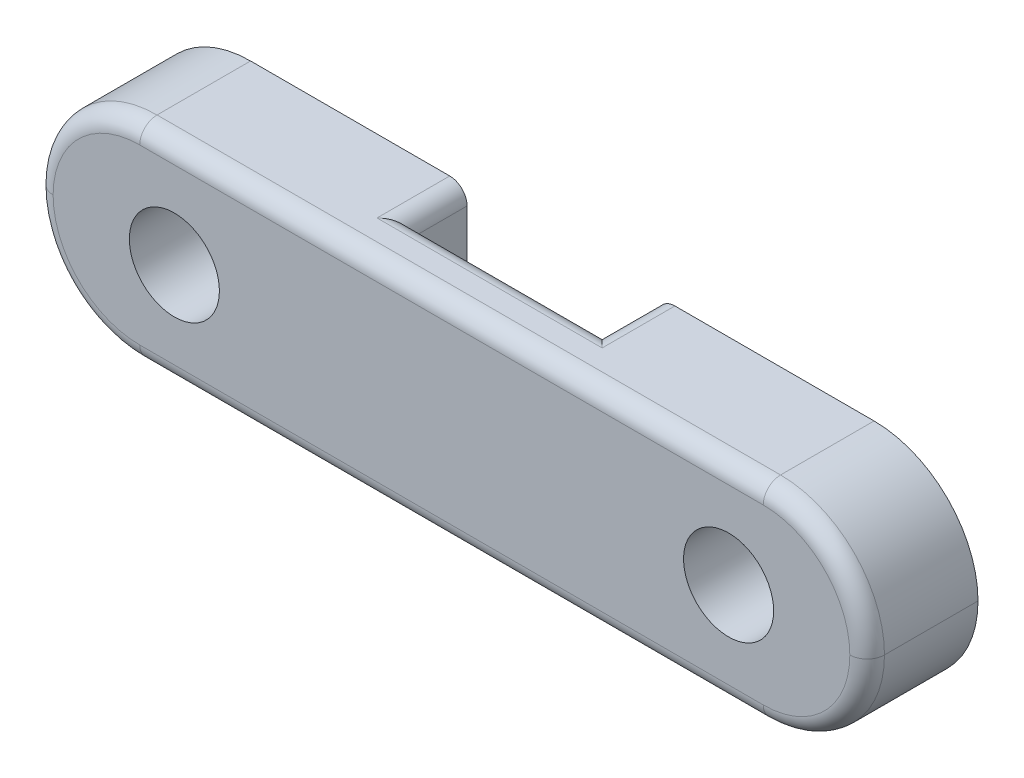
ISO-10303-21;
HEADER;
FILE_DESCRIPTION(('STEP AP214'),'2;1');
FILE_NAME('part.step','',(''),(''),'','','');
FILE_SCHEMA(('AUTOMOTIVE_DESIGN { 1 0 10303 214 1 1 1 1 }'));
ENDSEC;
DATA;
#1=APPLICATION_CONTEXT('core data for automotive mechanical design processes');
#2=APPLICATION_PROTOCOL_DEFINITION('international standard','automotive_design',2000,#1);
#3=PRODUCT_CONTEXT('',#1,'mechanical');
#4=PRODUCT('Part','Part','',(#3));
#5=PRODUCT_RELATED_PRODUCT_CATEGORY('part','',(#4));
#6=PRODUCT_DEFINITION_FORMATION('','',#4);
#7=PRODUCT_DEFINITION_CONTEXT('part definition',#1,'design');
#8=PRODUCT_DEFINITION('design','',#6,#7);
#9=PRODUCT_DEFINITION_SHAPE('','',#8);
#10=(LENGTH_UNIT() NAMED_UNIT(*) SI_UNIT(.MILLI.,.METRE.));
#11=(NAMED_UNIT(*) PLANE_ANGLE_UNIT() SI_UNIT($,.RADIAN.));
#12=(NAMED_UNIT(*) SI_UNIT($,.STERADIAN.) SOLID_ANGLE_UNIT());
#13=UNCERTAINTY_MEASURE_WITH_UNIT(LENGTH_MEASURE(1.E-05),#10,'distance_accuracy_value','');
#14=(GEOMETRIC_REPRESENTATION_CONTEXT(3) GLOBAL_UNCERTAINTY_ASSIGNED_CONTEXT((#13)) GLOBAL_UNIT_ASSIGNED_CONTEXT((#10,
#11,#12)) REPRESENTATION_CONTEXT('',''));
#15=CARTESIAN_POINT('',(0.,0.,0.));
#16=DIRECTION('',(0.,0.,1.));
#17=DIRECTION('',(1.,0.,0.));
#18=AXIS2_PLACEMENT_3D('',#15,#16,#17);
#19=CARTESIAN_POINT('',(0.,0.,0.));
#20=DIRECTION('',(0.,0.,-1.));
#21=DIRECTION('',(-1.,0.,0.));
#22=AXIS2_PLACEMENT_3D('',#19,#20,#21);
#23=PLANE('',#22);
#24=DIRECTION('',(0.,1.,0.));
#25=VECTOR('',#24,1.);
#26=CARTESIAN_POINT('',(-2.75,-3.,0.));
#27=LINE('',#26,#25);
#28=CARTESIAN_POINT('',(-2.75,-2.5,0.));
#29=VERTEX_POINT('',#28);
#30=CARTESIAN_POINT('',(-2.75,2.5,0.));
#31=VERTEX_POINT('',#30);
#32=EDGE_CURVE('E198',#29,#31,#27,.T.);
#33=ORIENTED_EDGE('',*,*,#32,.F.);
#34=CARTESIAN_POINT('',(-3.25,-2.5,0.));
#35=DIRECTION('',(0.,0.,-1.));
#36=DIRECTION('',(-1.,0.,0.));
#37=AXIS2_PLACEMENT_3D('',#34,#35,#36);
#38=CIRCLE('',#37,0.5);
#39=CARTESIAN_POINT('',(-3.25,-3.,0.));
#40=VERTEX_POINT('',#39);
#41=EDGE_CURVE('E11',#29,#40,#38,.T.);
#42=ORIENTED_EDGE('',*,*,#41,.T.);
#43=DIRECTION('',(1.,0.,0.));
#44=VECTOR('',#43,1.);
#45=CARTESIAN_POINT('',(-12.,-3.,0.));
#46=LINE('',#45,#44);
#47=CARTESIAN_POINT('',(-9.,-3.,0.));
#48=VERTEX_POINT('',#47);
#49=EDGE_CURVE('E159',#48,#40,#46,.T.);
#50=ORIENTED_EDGE('',*,*,#49,.F.);
#51=CARTESIAN_POINT('',(-9.,0.,0.));
#52=DIRECTION('',(0.,0.,-1.));
#53=DIRECTION('',(-1.,0.,0.));
#54=AXIS2_PLACEMENT_3D('',#51,#52,#53);
#55=CIRCLE('',#54,3.);
#56=CARTESIAN_POINT('',(-12.,0.,0.));
#57=VERTEX_POINT('',#56);
#58=EDGE_CURVE('E169',#48,#57,#55,.T.);
#59=ORIENTED_EDGE('',*,*,#58,.T.);
#60=CARTESIAN_POINT('',(-9.,0.,0.));
#61=DIRECTION('',(0.,0.,-1.));
#62=DIRECTION('',(-1.,0.,0.));
#63=AXIS2_PLACEMENT_3D('',#60,#61,#62);
#64=CIRCLE('',#63,3.);
#65=CARTESIAN_POINT('',(-9.,3.,0.));
#66=VERTEX_POINT('',#65);
#67=EDGE_CURVE('E165',#57,#66,#64,.T.);
#68=ORIENTED_EDGE('',*,*,#67,.T.);
#69=DIRECTION('',(-1.,0.,0.));
#70=VECTOR('',#69,1.);
#71=CARTESIAN_POINT('',(-12.,3.,0.));
#72=LINE('',#71,#70);
#73=CARTESIAN_POINT('',(-3.25,3.,0.));
#74=VERTEX_POINT('',#73);
#75=EDGE_CURVE('E294',#74,#66,#72,.T.);
#76=ORIENTED_EDGE('',*,*,#75,.F.);
#77=CARTESIAN_POINT('',(-3.25,2.5,0.));
#78=DIRECTION('',(0.,0.,-1.));
#79=DIRECTION('',(-1.,0.,0.));
#80=AXIS2_PLACEMENT_3D('',#77,#78,#79);
#81=CIRCLE('',#80,0.5);
#82=EDGE_CURVE('E42',#74,#31,#81,.T.);
#83=ORIENTED_EDGE('',*,*,#82,.T.);
#84=EDGE_LOOP('',(#33,#42,#50,#59,#68,#76,#83));
#85=FACE_BOUND('',#84,.T.);
#86=CARTESIAN_POINT('',(-8.,0.,0.));
#87=DIRECTION('',(0.,0.,1.));
#88=DIRECTION('',(1.,0.,0.));
#89=AXIS2_PLACEMENT_3D('',#86,#87,#88);
#90=CIRCLE('',#89,1.3);
#91=CARTESIAN_POINT('',(-6.7,0.,0.));
#92=VERTEX_POINT('',#91);
#93=EDGE_CURVE('E299',#92,#92,#90,.T.);
#94=ORIENTED_EDGE('',*,*,#93,.T.);
#95=EDGE_LOOP('',(#94));
#96=FACE_BOUND('',#95,.T.);
#97=ADVANCED_FACE('F33',(#85,#96),#23,.T.);
#98=CARTESIAN_POINT('',(0.,0.,3.2));
#99=DIRECTION('',(0.,0.,-1.));
#100=DIRECTION('',(-1.,0.,0.));
#101=AXIS2_PLACEMENT_3D('',#98,#99,#100);
#102=PLANE('',#101);
#103=CARTESIAN_POINT('',(9.,0.,3.2));
#104=DIRECTION('',(0.,0.,-1.));
#105=DIRECTION('',(-1.,0.,0.));
#106=AXIS2_PLACEMENT_3D('',#103,#104,#105);
#107=CIRCLE('',#106,2.5);
#108=CARTESIAN_POINT('',(9.,-2.5,3.2));
#109=VERTEX_POINT('',#108);
#110=CARTESIAN_POINT('',(11.5,0.,3.2));
#111=VERTEX_POINT('',#110);
#112=EDGE_CURVE('E210',#109,#111,#107,.F.);
#113=ORIENTED_EDGE('',*,*,#112,.T.);
#114=CARTESIAN_POINT('',(9.,0.,3.2));
#115=DIRECTION('',(0.,0.,-1.));
#116=DIRECTION('',(-1.,0.,0.));
#117=AXIS2_PLACEMENT_3D('',#114,#115,#116);
#118=CIRCLE('',#117,2.5);
#119=CARTESIAN_POINT('',(9.,2.5,3.2));
#120=VERTEX_POINT('',#119);
#121=EDGE_CURVE('E212',#111,#120,#118,.F.);
#122=ORIENTED_EDGE('',*,*,#121,.T.);
#123=DIRECTION('',(-1.,0.,0.));
#124=VECTOR('',#123,1.);
#125=CARTESIAN_POINT('',(0.,2.5,3.2));
#126=LINE('',#125,#124);
#127=CARTESIAN_POINT('',(-9.,2.5,3.2));
#128=VERTEX_POINT('',#127);
#129=EDGE_CURVE('E196',#120,#128,#126,.T.);
#130=ORIENTED_EDGE('',*,*,#129,.T.);
#131=CARTESIAN_POINT('',(-9.,0.,3.2));
#132=DIRECTION('',(0.,0.,-1.));
#133=DIRECTION('',(-1.,0.,0.));
#134=AXIS2_PLACEMENT_3D('',#131,#132,#133);
#135=CIRCLE('',#134,2.5);
#136=CARTESIAN_POINT('',(-11.5,0.,3.2));
#137=VERTEX_POINT('',#136);
#138=EDGE_CURVE('E204',#128,#137,#135,.F.);
#139=ORIENTED_EDGE('',*,*,#138,.T.);
#140=CARTESIAN_POINT('',(-9.,0.,3.2));
#141=DIRECTION('',(0.,0.,-1.));
#142=DIRECTION('',(-1.,0.,0.));
#143=AXIS2_PLACEMENT_3D('',#140,#141,#142);
#144=CIRCLE('',#143,2.5);
#145=CARTESIAN_POINT('',(-9.,-2.5,3.2));
#146=VERTEX_POINT('',#145);
#147=EDGE_CURVE('E206',#137,#146,#144,.F.);
#148=ORIENTED_EDGE('',*,*,#147,.T.);
#149=DIRECTION('',(1.,0.,0.));
#150=VECTOR('',#149,1.);
#151=CARTESIAN_POINT('',(0.,-2.5,3.2));
#152=LINE('',#151,#150);
#153=EDGE_CURVE('E208',#146,#109,#152,.T.);
#154=ORIENTED_EDGE('',*,*,#153,.T.);
#155=EDGE_LOOP('',(#113,#122,#130,#139,#148,#154));
#156=FACE_BOUND('',#155,.T.);
#157=CARTESIAN_POINT('',(-8.,0.,3.2));
#158=DIRECTION('',(0.,0.,1.));
#159=DIRECTION('',(1.,0.,0.));
#160=AXIS2_PLACEMENT_3D('',#157,#158,#159);
#161=CIRCLE('',#160,1.3);
#162=CARTESIAN_POINT('',(-6.7,0.,3.2));
#163=VERTEX_POINT('',#162);
#164=EDGE_CURVE('E296',#163,#163,#161,.T.);
#165=ORIENTED_EDGE('',*,*,#164,.F.);
#166=EDGE_LOOP('',(#165));
#167=FACE_BOUND('',#166,.T.);
#168=CARTESIAN_POINT('',(8.,0.,3.2));
#169=DIRECTION('',(0.,0.,1.));
#170=DIRECTION('',(1.,0.,0.));
#171=AXIS2_PLACEMENT_3D('',#168,#169,#170);
#172=CIRCLE('',#171,1.3);
#173=CARTESIAN_POINT('',(9.3,0.,3.2));
#174=VERTEX_POINT('',#173);
#175=EDGE_CURVE('E304',#174,#174,#172,.T.);
#176=ORIENTED_EDGE('',*,*,#175,.F.);
#177=EDGE_LOOP('',(#176));
#178=FACE_BOUND('',#177,.T.);
#179=ADVANCED_FACE('F358',(#156,#167,#178),#102,.F.);
#180=CARTESIAN_POINT('',(3.25,-3.,0.));
#181=VERTEX_POINT('',#180);
#182=CARTESIAN_POINT('',(9.,-3.,0.));
#183=VERTEX_POINT('',#182);
#184=EDGE_CURVE('E179',#181,#183,#46,.T.);
#185=ORIENTED_EDGE('',*,*,#184,.F.);
#186=CARTESIAN_POINT('',(3.25,-2.5,0.));
#187=DIRECTION('',(0.,0.,-1.));
#188=DIRECTION('',(-1.,0.,0.));
#189=AXIS2_PLACEMENT_3D('',#186,#187,#188);
#190=CIRCLE('',#189,0.5);
#191=CARTESIAN_POINT('',(2.75,-2.5,0.));
#192=VERTEX_POINT('',#191);
#193=EDGE_CURVE('E242',#181,#192,#190,.T.);
#194=ORIENTED_EDGE('',*,*,#193,.T.);
#195=DIRECTION('',(0.,-1.,0.));
#196=VECTOR('',#195,1.);
#197=CARTESIAN_POINT('',(2.75,-3.,0.));
#198=LINE('',#197,#196);
#199=CARTESIAN_POINT('',(2.75,2.5,0.));
#200=VERTEX_POINT('',#199);
#201=EDGE_CURVE('E312',#200,#192,#198,.T.);
#202=ORIENTED_EDGE('',*,*,#201,.F.);
#203=CARTESIAN_POINT('',(3.25,2.5,0.));
#204=DIRECTION('',(0.,0.,-1.));
#205=DIRECTION('',(-1.,0.,0.));
#206=AXIS2_PLACEMENT_3D('',#203,#204,#205);
#207=CIRCLE('',#206,0.5);
#208=CARTESIAN_POINT('',(3.25,3.,0.));
#209=VERTEX_POINT('',#208);
#210=EDGE_CURVE('E240',#200,#209,#207,.T.);
#211=ORIENTED_EDGE('',*,*,#210,.T.);
#212=CARTESIAN_POINT('',(9.,3.,0.));
#213=VERTEX_POINT('',#212);
#214=EDGE_CURVE('E182',#213,#209,#72,.T.);
#215=ORIENTED_EDGE('',*,*,#214,.F.);
#216=CARTESIAN_POINT('',(9.,0.,0.));
#217=DIRECTION('',(0.,0.,-1.));
#218=DIRECTION('',(-1.,0.,0.));
#219=AXIS2_PLACEMENT_3D('',#216,#217,#218);
#220=CIRCLE('',#219,3.);
#221=CARTESIAN_POINT('',(12.,0.,0.));
#222=VERTEX_POINT('',#221);
#223=EDGE_CURVE('E191',#213,#222,#220,.T.);
#224=ORIENTED_EDGE('',*,*,#223,.T.);
#225=CARTESIAN_POINT('',(9.,0.,0.));
#226=DIRECTION('',(0.,0.,-1.));
#227=DIRECTION('',(-1.,0.,0.));
#228=AXIS2_PLACEMENT_3D('',#225,#226,#227);
#229=CIRCLE('',#228,3.);
#230=EDGE_CURVE('E193',#222,#183,#229,.T.);
#231=ORIENTED_EDGE('',*,*,#230,.T.);
#232=EDGE_LOOP('',(#185,#194,#202,#211,#215,#224,#231));
#233=FACE_BOUND('',#232,.T.);
#234=CARTESIAN_POINT('',(8.,0.,0.));
#235=DIRECTION('',(0.,0.,1.));
#236=DIRECTION('',(1.,0.,0.));
#237=AXIS2_PLACEMENT_3D('',#234,#235,#236);
#238=CIRCLE('',#237,1.3);
#239=CARTESIAN_POINT('',(9.3,0.,0.));
#240=VERTEX_POINT('',#239);
#241=EDGE_CURVE('E306',#240,#240,#238,.T.);
#242=ORIENTED_EDGE('',*,*,#241,.T.);
#243=EDGE_LOOP('',(#242));
#244=FACE_BOUND('',#243,.T.);
#245=ADVANCED_FACE('F336',(#233,#244),#23,.T.);
#246=CARTESIAN_POINT('',(-12.,3.,3.2));
#247=DIRECTION('',(0.,-1.,0.));
#248=DIRECTION('',(1.,0.,0.));
#249=AXIS2_PLACEMENT_3D('',#246,#247,#248);
#250=PLANE('',#249);
#251=DIRECTION('',(0.,0.,-1.));
#252=VECTOR('',#251,1.);
#253=CARTESIAN_POINT('',(-9.,3.,3.2));
#254=LINE('',#253,#252);
#255=CARTESIAN_POINT('',(-9.,3.,2.7));
#256=VERTEX_POINT('',#255);
#257=EDGE_CURVE('E188',#66,#256,#254,.F.);
#258=ORIENTED_EDGE('',*,*,#257,.T.);
#259=DIRECTION('',(-1.,0.,0.));
#260=VECTOR('',#259,1.);
#261=CARTESIAN_POINT('',(-12.,3.,2.7));
#262=LINE('',#261,#260);
#263=CARTESIAN_POINT('',(9.,3.,2.7));
#264=VERTEX_POINT('',#263);
#265=EDGE_CURVE('E238',#256,#264,#262,.F.);
#266=ORIENTED_EDGE('',*,*,#265,.T.);
#267=DIRECTION('',(0.,0.,-1.));
#268=VECTOR('',#267,1.);
#269=CARTESIAN_POINT('',(9.,3.,3.2));
#270=LINE('',#269,#268);
#271=EDGE_CURVE('E175',#264,#213,#270,.T.);
#272=ORIENTED_EDGE('',*,*,#271,.T.);
#273=ORIENTED_EDGE('',*,*,#214,.T.);
#274=DIRECTION('',(0.,0.,-1.));
#275=VECTOR('',#274,1.);
#276=CARTESIAN_POINT('',(3.25,3.,3.2));
#277=LINE('',#276,#275);
#278=CARTESIAN_POINT('',(3.25,3.,2.1));
#279=VERTEX_POINT('',#278);
#280=EDGE_CURVE('E236',#209,#279,#277,.F.);
#281=ORIENTED_EDGE('',*,*,#280,.T.);
#282=DIRECTION('',(1.,0.,0.));
#283=VECTOR('',#282,1.);
#284=CARTESIAN_POINT('',(-12.,3.,2.1));
#285=LINE('',#284,#283);
#286=CARTESIAN_POINT('',(-3.25,3.,2.1));
#287=VERTEX_POINT('',#286);
#288=EDGE_CURVE('E232',#279,#287,#285,.F.);
#289=ORIENTED_EDGE('',*,*,#288,.T.);
#290=DIRECTION('',(0.,0.,-1.));
#291=VECTOR('',#290,1.);
#292=CARTESIAN_POINT('',(-3.25,3.,3.2));
#293=LINE('',#292,#291);
#294=EDGE_CURVE('E234',#287,#74,#293,.T.);
#295=ORIENTED_EDGE('',*,*,#294,.T.);
#296=ORIENTED_EDGE('',*,*,#75,.T.);
#297=EDGE_LOOP('',(#258,#266,#272,#273,#281,#289,#295,#296));
#298=FACE_BOUND('',#297,.T.);
#299=ADVANCED_FACE('F293',(#298),#250,.F.);
#300=CARTESIAN_POINT('',(-12.,-3.,3.2));
#301=DIRECTION('',(0.,1.,0.));
#302=DIRECTION('',(-1.,0.,0.));
#303=AXIS2_PLACEMENT_3D('',#300,#301,#302);
#304=PLANE('',#303);
#305=DIRECTION('',(0.,0.,-1.));
#306=VECTOR('',#305,1.);
#307=CARTESIAN_POINT('',(9.,-3.,3.2));
#308=LINE('',#307,#306);
#309=CARTESIAN_POINT('',(9.,-3.,2.7));
#310=VERTEX_POINT('',#309);
#311=EDGE_CURVE('E166',#183,#310,#308,.F.);
#312=ORIENTED_EDGE('',*,*,#311,.T.);
#313=DIRECTION('',(1.,0.,0.));
#314=VECTOR('',#313,1.);
#315=CARTESIAN_POINT('',(-12.,-3.,2.7));
#316=LINE('',#315,#314);
#317=CARTESIAN_POINT('',(-9.,-3.,2.7));
#318=VERTEX_POINT('',#317);
#319=EDGE_CURVE('E162',#310,#318,#316,.F.);
#320=ORIENTED_EDGE('',*,*,#319,.T.);
#321=DIRECTION('',(0.,0.,-1.));
#322=VECTOR('',#321,1.);
#323=CARTESIAN_POINT('',(-9.,-3.,3.2));
#324=LINE('',#323,#322);
#325=EDGE_CURVE('E154',#318,#48,#324,.T.);
#326=ORIENTED_EDGE('',*,*,#325,.T.);
#327=ORIENTED_EDGE('',*,*,#49,.T.);
#328=DIRECTION('',(0.,0.,-1.));
#329=VECTOR('',#328,1.);
#330=CARTESIAN_POINT('',(-3.25,-3.,3.2));
#331=LINE('',#330,#329);
#332=CARTESIAN_POINT('',(-3.25,-3.,2.1));
#333=VERTEX_POINT('',#332);
#334=EDGE_CURVE('E220',#40,#333,#331,.F.);
#335=ORIENTED_EDGE('',*,*,#334,.T.);
#336=DIRECTION('',(-1.,0.,0.));
#337=VECTOR('',#336,1.);
#338=CARTESIAN_POINT('',(-12.,-3.,2.1));
#339=LINE('',#338,#337);
#340=CARTESIAN_POINT('',(3.25,-3.,2.1));
#341=VERTEX_POINT('',#340);
#342=EDGE_CURVE('E222',#333,#341,#339,.F.);
#343=ORIENTED_EDGE('',*,*,#342,.T.);
#344=DIRECTION('',(0.,0.,-1.));
#345=VECTOR('',#344,1.);
#346=CARTESIAN_POINT('',(3.25,-3.,3.2));
#347=LINE('',#346,#345);
#348=EDGE_CURVE('E224',#341,#181,#347,.T.);
#349=ORIENTED_EDGE('',*,*,#348,.T.);
#350=ORIENTED_EDGE('',*,*,#184,.T.);
#351=EDGE_LOOP('',(#312,#320,#326,#327,#335,#343,#349,#350));
#352=FACE_BOUND('',#351,.T.);
#353=ADVANCED_FACE('F157',(#352),#304,.F.);
#354=CARTESIAN_POINT('',(-8.,0.,3.2));
#355=DIRECTION('',(0.,0.,-1.));
#356=DIRECTION('',(-1.,0.,0.));
#357=AXIS2_PLACEMENT_3D('',#354,#355,#356);
#358=CYLINDRICAL_SURFACE('',#357,1.3);
#359=ORIENTED_EDGE('',*,*,#164,.T.);
#360=EDGE_LOOP('',(#359));
#361=FACE_BOUND('',#360,.T.);
#362=ORIENTED_EDGE('',*,*,#93,.F.);
#363=EDGE_LOOP('',(#362));
#364=FACE_BOUND('',#363,.T.);
#365=ADVANCED_FACE('F410',(#361,#364),#358,.F.);
#366=CARTESIAN_POINT('',(8.,0.,3.2));
#367=DIRECTION('',(0.,0.,-1.));
#368=DIRECTION('',(-1.,0.,0.));
#369=AXIS2_PLACEMENT_3D('',#366,#367,#368);
#370=CYLINDRICAL_SURFACE('',#369,1.3);
#371=ORIENTED_EDGE('',*,*,#175,.T.);
#372=EDGE_LOOP('',(#371));
#373=FACE_BOUND('',#372,.T.);
#374=ORIENTED_EDGE('',*,*,#241,.F.);
#375=EDGE_LOOP('',(#374));
#376=FACE_BOUND('',#375,.T.);
#377=ADVANCED_FACE('F546',(#373,#376),#370,.F.);
#378=CARTESIAN_POINT('',(-2.75,-3.,1.6));
#379=DIRECTION('',(-1.,0.,0.));
#380=DIRECTION('',(0.,0.,1.));
#381=AXIS2_PLACEMENT_3D('',#378,#379,#380);
#382=PLANE('',#381);
#383=DIRECTION('',(0.,1.,0.));
#384=VECTOR('',#383,1.);
#385=CARTESIAN_POINT('',(-2.75,-3.,1.6));
#386=LINE('',#385,#384);
#387=CARTESIAN_POINT('',(-2.75,-2.5,1.6));
#388=VERTEX_POINT('',#387);
#389=CARTESIAN_POINT('',(-2.75,2.5,1.6));
#390=VERTEX_POINT('',#389);
#391=EDGE_CURVE('E315',#388,#390,#386,.T.);
#392=ORIENTED_EDGE('',*,*,#391,.F.);
#393=DIRECTION('',(0.,0.,-1.));
#394=VECTOR('',#393,1.);
#395=CARTESIAN_POINT('',(-2.75,-2.5,1.6));
#396=LINE('',#395,#394);
#397=EDGE_CURVE('E56',#388,#29,#396,.T.);
#398=ORIENTED_EDGE('',*,*,#397,.T.);
#399=ORIENTED_EDGE('',*,*,#32,.T.);
#400=DIRECTION('',(0.,0.,-1.));
#401=VECTOR('',#400,1.);
#402=CARTESIAN_POINT('',(-2.75,2.5,1.6));
#403=LINE('',#402,#401);
#404=EDGE_CURVE('E253',#31,#390,#403,.F.);
#405=ORIENTED_EDGE('',*,*,#404,.T.);
#406=EDGE_LOOP('',(#392,#398,#399,#405));
#407=FACE_BOUND('',#406,.T.);
#408=ADVANCED_FACE('F324',(#407),#382,.F.);
#409=CARTESIAN_POINT('',(2.75,-3.,1.6));
#410=DIRECTION('',(1.,0.,0.));
#411=DIRECTION('',(0.,0.,-1.));
#412=AXIS2_PLACEMENT_3D('',#409,#410,#411);
#413=PLANE('',#412);
#414=ORIENTED_EDGE('',*,*,#201,.T.);
#415=DIRECTION('',(0.,0.,-1.));
#416=VECTOR('',#415,1.);
#417=CARTESIAN_POINT('',(2.75,-2.5,1.6));
#418=LINE('',#417,#416);
#419=CARTESIAN_POINT('',(2.75,-2.5,1.6));
#420=VERTEX_POINT('',#419);
#421=EDGE_CURVE('E247',#192,#420,#418,.F.);
#422=ORIENTED_EDGE('',*,*,#421,.T.);
#423=DIRECTION('',(0.,-1.,0.));
#424=VECTOR('',#423,1.);
#425=CARTESIAN_POINT('',(2.75,-3.,1.6));
#426=LINE('',#425,#424);
#427=CARTESIAN_POINT('',(2.75,2.5,1.6));
#428=VERTEX_POINT('',#427);
#429=EDGE_CURVE('E309',#428,#420,#426,.T.);
#430=ORIENTED_EDGE('',*,*,#429,.F.);
#431=DIRECTION('',(0.,0.,-1.));
#432=VECTOR('',#431,1.);
#433=CARTESIAN_POINT('',(2.75,2.5,1.6));
#434=LINE('',#433,#432);
#435=EDGE_CURVE('E244',#428,#200,#434,.T.);
#436=ORIENTED_EDGE('',*,*,#435,.T.);
#437=EDGE_LOOP('',(#414,#422,#430,#436));
#438=FACE_BOUND('',#437,.T.);
#439=ADVANCED_FACE('F384',(#438),#413,.F.);
#440=CARTESIAN_POINT('',(0.,0.,1.6));
#441=DIRECTION('',(0.,0.,1.));
#442=DIRECTION('',(1.,0.,0.));
#443=AXIS2_PLACEMENT_3D('',#440,#441,#442);
#444=PLANE('',#443);
#445=ORIENTED_EDGE('',*,*,#429,.T.);
#446=DIRECTION('',(-1.,0.,0.));
#447=VECTOR('',#446,1.);
#448=CARTESIAN_POINT('',(0.,-2.5,1.6));
#449=LINE('',#448,#447);
#450=EDGE_CURVE('E251',#420,#388,#449,.T.);
#451=ORIENTED_EDGE('',*,*,#450,.T.);
#452=ORIENTED_EDGE('',*,*,#391,.T.);
#453=DIRECTION('',(1.,0.,0.));
#454=VECTOR('',#453,1.);
#455=CARTESIAN_POINT('',(0.,2.5,1.6));
#456=LINE('',#455,#454);
#457=EDGE_CURVE('E249',#390,#428,#456,.T.);
#458=ORIENTED_EDGE('',*,*,#457,.T.);
#459=EDGE_LOOP('',(#445,#451,#452,#458));
#460=FACE_BOUND('',#459,.T.);
#461=ADVANCED_FACE('F321',(#460),#444,.F.);
#462=CARTESIAN_POINT('',(-9.,0.,3.2));
#463=DIRECTION('',(0.,0.,-1.));
#464=DIRECTION('',(-1.,0.,0.));
#465=AXIS2_PLACEMENT_3D('',#462,#463,#464);
#466=CYLINDRICAL_SURFACE('',#465,3.);
#467=DIRECTION('',(0.,0.,-1.));
#468=VECTOR('',#467,1.);
#469=CARTESIAN_POINT('',(-12.,0.,3.2));
#470=LINE('',#469,#468);
#471=CARTESIAN_POINT('',(-12.,0.,2.7));
#472=VERTEX_POINT('',#471);
#473=EDGE_CURVE('E172',#472,#57,#470,.T.);
#474=ORIENTED_EDGE('',*,*,#473,.F.);
#475=CARTESIAN_POINT('',(-9.,0.,2.7));
#476=DIRECTION('',(0.,0.,-1.));
#477=DIRECTION('',(-1.,0.,0.));
#478=AXIS2_PLACEMENT_3D('',#475,#476,#477);
#479=CIRCLE('',#478,3.);
#480=EDGE_CURVE('E230',#472,#256,#479,.T.);
#481=ORIENTED_EDGE('',*,*,#480,.T.);
#482=ORIENTED_EDGE('',*,*,#257,.F.);
#483=ORIENTED_EDGE('',*,*,#67,.F.);
#484=EDGE_LOOP('',(#474,#481,#482,#483));
#485=FACE_BOUND('',#484,.T.);
#486=ADVANCED_FACE('F367',(#485),#466,.T.);
#487=CARTESIAN_POINT('',(-9.,0.,3.2));
#488=DIRECTION('',(0.,0.,-1.));
#489=DIRECTION('',(-1.,0.,0.));
#490=AXIS2_PLACEMENT_3D('',#487,#488,#489);
#491=CYLINDRICAL_SURFACE('',#490,3.);
#492=ORIENTED_EDGE('',*,*,#325,.F.);
#493=CARTESIAN_POINT('',(-9.,0.,2.7));
#494=DIRECTION('',(0.,0.,-1.));
#495=DIRECTION('',(-1.,0.,0.));
#496=AXIS2_PLACEMENT_3D('',#493,#494,#495);
#497=CIRCLE('',#496,3.);
#498=EDGE_CURVE('E228',#318,#472,#497,.T.);
#499=ORIENTED_EDGE('',*,*,#498,.T.);
#500=ORIENTED_EDGE('',*,*,#473,.T.);
#501=ORIENTED_EDGE('',*,*,#58,.F.);
#502=EDGE_LOOP('',(#492,#499,#500,#501));
#503=FACE_BOUND('',#502,.T.);
#504=ADVANCED_FACE('F170',(#503),#491,.T.);
#505=CARTESIAN_POINT('',(9.,0.,3.2));
#506=DIRECTION('',(0.,0.,-1.));
#507=DIRECTION('',(-1.,0.,0.));
#508=AXIS2_PLACEMENT_3D('',#505,#506,#507);
#509=CYLINDRICAL_SURFACE('',#508,3.);
#510=ORIENTED_EDGE('',*,*,#271,.F.);
#511=CARTESIAN_POINT('',(9.,0.,2.7));
#512=DIRECTION('',(0.,0.,-1.));
#513=DIRECTION('',(-1.,0.,0.));
#514=AXIS2_PLACEMENT_3D('',#511,#512,#513);
#515=CIRCLE('',#514,3.);
#516=CARTESIAN_POINT('',(12.,0.,2.7));
#517=VERTEX_POINT('',#516);
#518=EDGE_CURVE('E215',#264,#517,#515,.T.);
#519=ORIENTED_EDGE('',*,*,#518,.T.);
#520=DIRECTION('',(0.,0.,-1.));
#521=VECTOR('',#520,1.);
#522=CARTESIAN_POINT('',(12.,0.,3.2));
#523=LINE('',#522,#521);
#524=EDGE_CURVE('E199',#222,#517,#523,.F.);
#525=ORIENTED_EDGE('',*,*,#524,.F.);
#526=ORIENTED_EDGE('',*,*,#223,.F.);
#527=EDGE_LOOP('',(#510,#519,#525,#526));
#528=FACE_BOUND('',#527,.T.);
#529=ADVANCED_FACE('F381',(#528),#509,.T.);
#530=CARTESIAN_POINT('',(9.,0.,3.2));
#531=DIRECTION('',(0.,0.,-1.));
#532=DIRECTION('',(-1.,0.,0.));
#533=AXIS2_PLACEMENT_3D('',#530,#531,#532);
#534=CYLINDRICAL_SURFACE('',#533,3.);
#535=ORIENTED_EDGE('',*,*,#524,.T.);
#536=CARTESIAN_POINT('',(9.,0.,2.7));
#537=DIRECTION('',(0.,0.,-1.));
#538=DIRECTION('',(-1.,0.,0.));
#539=AXIS2_PLACEMENT_3D('',#536,#537,#538);
#540=CIRCLE('',#539,3.);
#541=EDGE_CURVE('E218',#517,#310,#540,.T.);
#542=ORIENTED_EDGE('',*,*,#541,.T.);
#543=ORIENTED_EDGE('',*,*,#311,.F.);
#544=ORIENTED_EDGE('',*,*,#230,.F.);
#545=EDGE_LOOP('',(#535,#542,#543,#544));
#546=FACE_BOUND('',#545,.T.);
#547=ADVANCED_FACE('F345',(#546),#534,.T.);
#548=CARTESIAN_POINT('',(-9.,0.,2.7));
#549=DIRECTION('',(0.,0.,-1.));
#550=DIRECTION('',(-1.,0.,0.));
#551=AXIS2_PLACEMENT_3D('',#548,#549,#550);
#552=TOROIDAL_SURFACE('',#551,2.5,0.5);
#553=CARTESIAN_POINT('',(-11.5,0.,2.7));
#554=DIRECTION('',(0.,1.,0.));
#555=DIRECTION('',(-1.,0.,0.));
#556=AXIS2_PLACEMENT_3D('',#553,#554,#555);
#557=CIRCLE('',#556,0.5);
#558=EDGE_CURVE('E268',#472,#137,#557,.T.);
#559=ORIENTED_EDGE('',*,*,#558,.F.);
#560=ORIENTED_EDGE('',*,*,#498,.F.);
#561=CARTESIAN_POINT('',(-9.,-2.5,2.7));
#562=DIRECTION('',(1.,0.,0.));
#563=DIRECTION('',(0.,0.,-1.));
#564=AXIS2_PLACEMENT_3D('',#561,#562,#563);
#565=CIRCLE('',#564,0.5);
#566=EDGE_CURVE('E202',#146,#318,#565,.T.);
#567=ORIENTED_EDGE('',*,*,#566,.F.);
#568=ORIENTED_EDGE('',*,*,#147,.F.);
#569=EDGE_LOOP('',(#559,#560,#567,#568));
#570=FACE_BOUND('',#569,.T.);
#571=ADVANCED_FACE('F364',(#570),#552,.T.);
#572=CARTESIAN_POINT('',(0.,-2.5,2.7));
#573=DIRECTION('',(1.,0.,0.));
#574=DIRECTION('',(0.,1.,0.));
#575=AXIS2_PLACEMENT_3D('',#572,#573,#574);
#576=CYLINDRICAL_SURFACE('',#575,0.5);
#577=ORIENTED_EDGE('',*,*,#566,.T.);
#578=ORIENTED_EDGE('',*,*,#319,.F.);
#579=CARTESIAN_POINT('',(9.,-2.5,2.7));
#580=DIRECTION('',(1.,0.,0.));
#581=DIRECTION('',(0.,0.,-1.));
#582=AXIS2_PLACEMENT_3D('',#579,#580,#581);
#583=CIRCLE('',#582,0.5);
#584=EDGE_CURVE('E265',#109,#310,#583,.T.);
#585=ORIENTED_EDGE('',*,*,#584,.F.);
#586=ORIENTED_EDGE('',*,*,#153,.F.);
#587=EDGE_LOOP('',(#577,#578,#585,#586));
#588=FACE_BOUND('',#587,.T.);
#589=ADVANCED_FACE('F349',(#588),#576,.T.);
#590=CARTESIAN_POINT('',(-9.,0.,2.7));
#591=DIRECTION('',(0.,0.,-1.));
#592=DIRECTION('',(-1.,0.,0.));
#593=AXIS2_PLACEMENT_3D('',#590,#591,#592);
#594=TOROIDAL_SURFACE('',#593,2.5,0.5);
#595=ORIENTED_EDGE('',*,*,#558,.T.);
#596=ORIENTED_EDGE('',*,*,#138,.F.);
#597=CARTESIAN_POINT('',(-9.,2.5,2.7));
#598=DIRECTION('',(1.,0.,0.));
#599=DIRECTION('',(0.,0.,-1.));
#600=AXIS2_PLACEMENT_3D('',#597,#598,#599);
#601=CIRCLE('',#600,0.5);
#602=EDGE_CURVE('E262',#256,#128,#601,.T.);
#603=ORIENTED_EDGE('',*,*,#602,.F.);
#604=ORIENTED_EDGE('',*,*,#480,.F.);
#605=EDGE_LOOP('',(#595,#596,#603,#604));
#606=FACE_BOUND('',#605,.T.);
#607=ADVANCED_FACE('F372',(#606),#594,.T.);
#608=CARTESIAN_POINT('',(9.,0.,2.7));
#609=DIRECTION('',(0.,0.,-1.));
#610=DIRECTION('',(-1.,0.,0.));
#611=AXIS2_PLACEMENT_3D('',#608,#609,#610);
#612=TOROIDAL_SURFACE('',#611,2.5,0.5);
#613=ORIENTED_EDGE('',*,*,#584,.T.);
#614=ORIENTED_EDGE('',*,*,#541,.F.);
#615=CARTESIAN_POINT('',(11.5,0.,2.7));
#616=DIRECTION('',(0.,1.,0.));
#617=DIRECTION('',(-1.,0.,0.));
#618=AXIS2_PLACEMENT_3D('',#615,#616,#617);
#619=CIRCLE('',#618,0.5);
#620=EDGE_CURVE('E259',#111,#517,#619,.T.);
#621=ORIENTED_EDGE('',*,*,#620,.F.);
#622=ORIENTED_EDGE('',*,*,#112,.F.);
#623=EDGE_LOOP('',(#613,#614,#621,#622));
#624=FACE_BOUND('',#623,.T.);
#625=ADVANCED_FACE('F354',(#624),#612,.T.);
#626=CARTESIAN_POINT('',(0.,2.5,2.7));
#627=DIRECTION('',(-1.,0.,0.));
#628=DIRECTION('',(0.,-1.,0.));
#629=AXIS2_PLACEMENT_3D('',#626,#627,#628);
#630=CYLINDRICAL_SURFACE('',#629,0.5);
#631=ORIENTED_EDGE('',*,*,#602,.T.);
#632=ORIENTED_EDGE('',*,*,#129,.F.);
#633=CARTESIAN_POINT('',(9.,2.5,2.7));
#634=DIRECTION('',(1.,0.,0.));
#635=DIRECTION('',(0.,0.,-1.));
#636=AXIS2_PLACEMENT_3D('',#633,#634,#635);
#637=CIRCLE('',#636,0.5);
#638=EDGE_CURVE('E257',#264,#120,#637,.T.);
#639=ORIENTED_EDGE('',*,*,#638,.F.);
#640=ORIENTED_EDGE('',*,*,#265,.F.);
#641=EDGE_LOOP('',(#631,#632,#639,#640));
#642=FACE_BOUND('',#641,.T.);
#643=ADVANCED_FACE('F376',(#642),#630,.T.);
#644=CARTESIAN_POINT('',(9.,0.,2.7));
#645=DIRECTION('',(0.,0.,-1.));
#646=DIRECTION('',(-1.,0.,0.));
#647=AXIS2_PLACEMENT_3D('',#644,#645,#646);
#648=TOROIDAL_SURFACE('',#647,2.5,0.5);
#649=ORIENTED_EDGE('',*,*,#620,.T.);
#650=ORIENTED_EDGE('',*,*,#518,.F.);
#651=ORIENTED_EDGE('',*,*,#638,.T.);
#652=ORIENTED_EDGE('',*,*,#121,.F.);
#653=EDGE_LOOP('',(#649,#650,#651,#652));
#654=FACE_BOUND('',#653,.T.);
#655=ADVANCED_FACE('F379',(#654),#648,.T.);
#656=CARTESIAN_POINT('',(-3.25,-2.5,1.6));
#657=DIRECTION('',(0.,0.,-1.));
#658=DIRECTION('',(-1.,0.,0.));
#659=AXIS2_PLACEMENT_3D('',#656,#657,#658);
#660=CYLINDRICAL_SURFACE('',#659,0.5);
#661=ORIENTED_EDGE('',*,*,#41,.F.);
#662=ORIENTED_EDGE('',*,*,#397,.F.);
#663=CARTESIAN_POINT('',(-3.25,-2.5,2.1));
#664=DIRECTION('',(-0.707106781186547,0.,-0.707106781186547));
#665=DIRECTION('',(-0.707106781186547,0.,0.707106781186547));
#666=AXIS2_PLACEMENT_3D('',#663,#664,#665);
#667=ELLIPSE('',#666,0.707106781186547,0.5);
#668=EDGE_CURVE('E260',#333,#388,#667,.F.);
#669=ORIENTED_EDGE('',*,*,#668,.F.);
#670=ORIENTED_EDGE('',*,*,#334,.F.);
#671=EDGE_LOOP('',(#661,#662,#669,#670));
#672=FACE_BOUND('',#671,.T.);
#673=ADVANCED_FACE('F327',(#672),#660,.T.);
#674=CARTESIAN_POINT('',(0.,-2.5,2.1));
#675=DIRECTION('',(-1.,0.,0.));
#676=DIRECTION('',(0.,-1.,0.));
#677=AXIS2_PLACEMENT_3D('',#674,#675,#676);
#678=CYLINDRICAL_SURFACE('',#677,0.5);
#679=ORIENTED_EDGE('',*,*,#668,.T.);
#680=ORIENTED_EDGE('',*,*,#450,.F.);
#681=CARTESIAN_POINT('',(3.25,-2.5,2.1));
#682=DIRECTION('',(0.707106781186547,0.,-0.707106781186547));
#683=DIRECTION('',(-0.707106781186547,0.,-0.707106781186547));
#684=AXIS2_PLACEMENT_3D('',#681,#682,#683);
#685=ELLIPSE('',#684,0.707106781186547,0.5);
#686=EDGE_CURVE('E273',#341,#420,#685,.T.);
#687=ORIENTED_EDGE('',*,*,#686,.F.);
#688=ORIENTED_EDGE('',*,*,#342,.F.);
#689=EDGE_LOOP('',(#679,#680,#687,#688));
#690=FACE_BOUND('',#689,.T.);
#691=ADVANCED_FACE('F330',(#690),#678,.T.);
#692=CARTESIAN_POINT('',(3.25,-2.5,3.2));
#693=DIRECTION('',(0.,0.,-1.));
#694=DIRECTION('',(-1.,0.,0.));
#695=AXIS2_PLACEMENT_3D('',#692,#693,#694);
#696=CYLINDRICAL_SURFACE('',#695,0.5);
#697=ORIENTED_EDGE('',*,*,#686,.T.);
#698=ORIENTED_EDGE('',*,*,#421,.F.);
#699=ORIENTED_EDGE('',*,*,#193,.F.);
#700=ORIENTED_EDGE('',*,*,#348,.F.);
#701=EDGE_LOOP('',(#697,#698,#699,#700));
#702=FACE_BOUND('',#701,.T.);
#703=ADVANCED_FACE('F386',(#702),#696,.T.);
#704=CARTESIAN_POINT('',(-3.25,2.5,3.2));
#705=DIRECTION('',(0.,0.,-1.));
#706=DIRECTION('',(-1.,0.,0.));
#707=AXIS2_PLACEMENT_3D('',#704,#705,#706);
#708=CYLINDRICAL_SURFACE('',#707,0.5);
#709=ORIENTED_EDGE('',*,*,#82,.F.);
#710=ORIENTED_EDGE('',*,*,#294,.F.);
#711=CARTESIAN_POINT('',(-3.25,2.5,2.1));
#712=DIRECTION('',(-0.707106781186547,0.,-0.707106781186547));
#713=DIRECTION('',(0.707106781186547,0.,-0.707106781186547));
#714=AXIS2_PLACEMENT_3D('',#711,#712,#713);
#715=ELLIPSE('',#714,0.707106781186547,0.5);
#716=EDGE_CURVE('E37',#390,#287,#715,.F.);
#717=ORIENTED_EDGE('',*,*,#716,.F.);
#718=ORIENTED_EDGE('',*,*,#404,.F.);
#719=EDGE_LOOP('',(#709,#710,#717,#718));
#720=FACE_BOUND('',#719,.T.);
#721=ADVANCED_FACE('F35',(#720),#708,.T.);
#722=CARTESIAN_POINT('',(0.,2.5,2.1));
#723=DIRECTION('',(1.,0.,0.));
#724=DIRECTION('',(0.,1.,0.));
#725=AXIS2_PLACEMENT_3D('',#722,#723,#724);
#726=CYLINDRICAL_SURFACE('',#725,0.5);
#727=ORIENTED_EDGE('',*,*,#716,.T.);
#728=ORIENTED_EDGE('',*,*,#288,.F.);
#729=CARTESIAN_POINT('',(3.25,2.5,2.1));
#730=DIRECTION('',(0.707106781186547,0.,-0.707106781186547));
#731=DIRECTION('',(-0.707106781186547,0.,-0.707106781186547));
#732=AXIS2_PLACEMENT_3D('',#729,#730,#731);
#733=ELLIPSE('',#732,0.707106781186547,0.5);
#734=EDGE_CURVE('E277',#428,#279,#733,.T.);
#735=ORIENTED_EDGE('',*,*,#734,.F.);
#736=ORIENTED_EDGE('',*,*,#457,.F.);
#737=EDGE_LOOP('',(#727,#728,#735,#736));
#738=FACE_BOUND('',#737,.T.);
#739=ADVANCED_FACE('F288',(#738),#726,.T.);
#740=CARTESIAN_POINT('',(3.25,2.5,1.6));
#741=DIRECTION('',(0.,0.,-1.));
#742=DIRECTION('',(-1.,0.,0.));
#743=AXIS2_PLACEMENT_3D('',#740,#741,#742);
#744=CYLINDRICAL_SURFACE('',#743,0.5);
#745=ORIENTED_EDGE('',*,*,#734,.T.);
#746=ORIENTED_EDGE('',*,*,#280,.F.);
#747=ORIENTED_EDGE('',*,*,#210,.F.);
#748=ORIENTED_EDGE('',*,*,#435,.F.);
#749=EDGE_LOOP('',(#745,#746,#747,#748));
#750=FACE_BOUND('',#749,.T.);
#751=ADVANCED_FACE('F382',(#750),#744,.T.);
#752=CLOSED_SHELL('',(#97,#179,#245,#299,#353,#365,#377,#408,#439,#461,#486,#504,#529,#547,#571,
#589,#607,#625,#643,#655,#673,#691,#703,#721,#739,#751));
#753=MANIFOLD_SOLID_BREP('B2',#752);
#754=ADVANCED_BREP_SHAPE_REPRESENTATION('',(#18,#753),#14);
#755=SHAPE_DEFINITION_REPRESENTATION(#9,#754);
ENDSEC;
END-ISO-10303-21;
